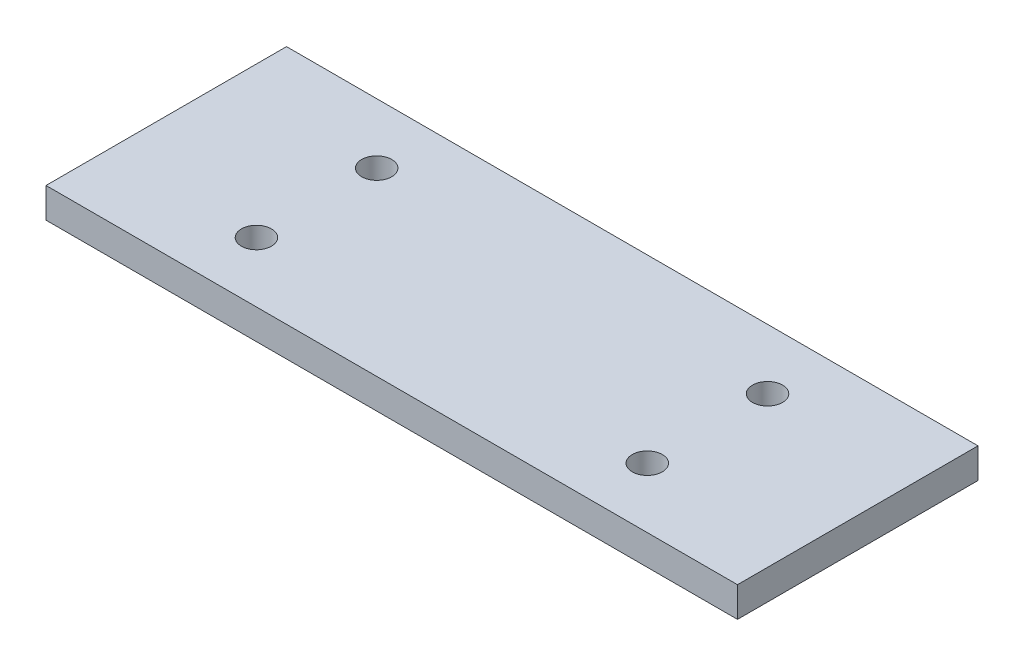
ISO-10303-21;
HEADER;
FILE_DESCRIPTION(('STEP AP214'),'2;1');
FILE_NAME('part.step','',(''),(''),'','','');
FILE_SCHEMA(('AUTOMOTIVE_DESIGN { 1 0 10303 214 1 1 1 1 }'));
ENDSEC;
DATA;
#1=APPLICATION_CONTEXT('core data for automotive mechanical design processes');
#2=APPLICATION_PROTOCOL_DEFINITION('international standard','automotive_design',2000,#1);
#3=PRODUCT_CONTEXT('',#1,'mechanical');
#4=PRODUCT('Part','Part','',(#3));
#5=PRODUCT_RELATED_PRODUCT_CATEGORY('part','',(#4));
#6=PRODUCT_DEFINITION_FORMATION('','',#4);
#7=PRODUCT_DEFINITION_CONTEXT('part definition',#1,'design');
#8=PRODUCT_DEFINITION('design','',#6,#7);
#9=PRODUCT_DEFINITION_SHAPE('','',#8);
#10=(LENGTH_UNIT() NAMED_UNIT(*) SI_UNIT(.MILLI.,.METRE.));
#11=(NAMED_UNIT(*) PLANE_ANGLE_UNIT() SI_UNIT($,.RADIAN.));
#12=(NAMED_UNIT(*) SI_UNIT($,.STERADIAN.) SOLID_ANGLE_UNIT());
#13=UNCERTAINTY_MEASURE_WITH_UNIT(LENGTH_MEASURE(1.E-05),#10,'distance_accuracy_value','');
#14=(GEOMETRIC_REPRESENTATION_CONTEXT(3) GLOBAL_UNCERTAINTY_ASSIGNED_CONTEXT((#13)) GLOBAL_UNIT_ASSIGNED_CONTEXT((#10,
#11,#12)) REPRESENTATION_CONTEXT('',''));
#15=CARTESIAN_POINT('',(0.,0.,0.));
#16=DIRECTION('',(0.,0.,1.));
#17=DIRECTION('',(1.,0.,0.));
#18=AXIS2_PLACEMENT_3D('',#15,#16,#17);
#19=CARTESIAN_POINT('',(0.,2.5,0.));
#20=DIRECTION('',(0.,-1.,0.));
#21=DIRECTION('',(0.,0.,-1.));
#22=AXIS2_PLACEMENT_3D('',#19,#20,#21);
#23=PLANE('',#22);
#24=DIRECTION('',(0.,0.,-1.));
#25=VECTOR('',#24,1.);
#26=CARTESIAN_POINT('',(57.5,2.5,20.));
#27=LINE('',#26,#25);
#28=CARTESIAN_POINT('',(57.5,2.5,20.));
#29=VERTEX_POINT('',#28);
#30=CARTESIAN_POINT('',(57.5,2.5,-20.));
#31=VERTEX_POINT('',#30);
#32=EDGE_CURVE('E91',#29,#31,#27,.T.);
#33=ORIENTED_EDGE('',*,*,#32,.T.);
#34=DIRECTION('',(-1.,0.,0.));
#35=VECTOR('',#34,1.);
#36=CARTESIAN_POINT('',(-57.5,2.5,-20.));
#37=LINE('',#36,#35);
#38=CARTESIAN_POINT('',(-57.5,2.5,-20.));
#39=VERTEX_POINT('',#38);
#40=EDGE_CURVE('E86',#31,#39,#37,.T.);
#41=ORIENTED_EDGE('',*,*,#40,.T.);
#42=DIRECTION('',(0.,0.,1.));
#43=VECTOR('',#42,1.);
#44=CARTESIAN_POINT('',(-57.5,2.5,20.));
#45=LINE('',#44,#43);
#46=CARTESIAN_POINT('',(-57.5,2.5,20.));
#47=VERTEX_POINT('',#46);
#48=EDGE_CURVE('E87',#39,#47,#45,.T.);
#49=ORIENTED_EDGE('',*,*,#48,.T.);
#50=DIRECTION('',(1.,0.,0.));
#51=VECTOR('',#50,1.);
#52=CARTESIAN_POINT('',(-57.5,2.5,20.));
#53=LINE('',#52,#51);
#54=EDGE_CURVE('E57',#47,#29,#53,.T.);
#55=ORIENTED_EDGE('',*,*,#54,.T.);
#56=EDGE_LOOP('',(#33,#41,#49,#55));
#57=FACE_BOUND('',#56,.T.);
#58=CARTESIAN_POINT('',(32.5,2.5,-10.));
#59=DIRECTION('',(0.,1.,0.));
#60=DIRECTION('',(0.,0.,1.));
#61=AXIS2_PLACEMENT_3D('',#58,#59,#60);
#62=CIRCLE('',#61,2.5);
#63=CARTESIAN_POINT('',(32.5,2.5,-7.5));
#64=VERTEX_POINT('',#63);
#65=EDGE_CURVE('E106',#64,#64,#62,.T.);
#66=ORIENTED_EDGE('',*,*,#65,.F.);
#67=EDGE_LOOP('',(#66));
#68=FACE_BOUND('',#67,.T.);
#69=CARTESIAN_POINT('',(32.5,2.5,10.));
#70=DIRECTION('',(0.,1.,0.));
#71=DIRECTION('',(0.,0.,-1.));
#72=AXIS2_PLACEMENT_3D('',#69,#70,#71);
#73=CIRCLE('',#72,2.5);
#74=CARTESIAN_POINT('',(32.5,2.5,7.50000000000003));
#75=VERTEX_POINT('',#74);
#76=EDGE_CURVE('E123',#75,#75,#73,.T.);
#77=ORIENTED_EDGE('',*,*,#76,.F.);
#78=EDGE_LOOP('',(#77));
#79=FACE_BOUND('',#78,.T.);
#80=CARTESIAN_POINT('',(-32.5,2.5,9.99999999999999));
#81=DIRECTION('',(0.,1.,0.));
#82=DIRECTION('',(0.,0.,1.));
#83=AXIS2_PLACEMENT_3D('',#80,#81,#82);
#84=CIRCLE('',#83,2.5);
#85=CARTESIAN_POINT('',(-32.5,2.5,12.5));
#86=VERTEX_POINT('',#85);
#87=EDGE_CURVE('E130',#86,#86,#84,.T.);
#88=ORIENTED_EDGE('',*,*,#87,.F.);
#89=EDGE_LOOP('',(#88));
#90=FACE_BOUND('',#89,.T.);
#91=CARTESIAN_POINT('',(-32.5,2.5,-10.));
#92=DIRECTION('',(0.,1.,0.));
#93=DIRECTION('',(0.,0.,-1.));
#94=AXIS2_PLACEMENT_3D('',#91,#92,#93);
#95=CIRCLE('',#94,2.5);
#96=CARTESIAN_POINT('',(-32.5,2.5,-12.5));
#97=VERTEX_POINT('',#96);
#98=EDGE_CURVE('E133',#97,#97,#95,.T.);
#99=ORIENTED_EDGE('',*,*,#98,.F.);
#100=EDGE_LOOP('',(#99));
#101=FACE_BOUND('',#100,.T.);
#102=ADVANCED_FACE('F39',(#57,#68,#79,#90,#101),#23,.F.);
#103=CARTESIAN_POINT('',(0.,-2.5,0.));
#104=DIRECTION('',(0.,-1.,0.));
#105=DIRECTION('',(0.,0.,-1.));
#106=AXIS2_PLACEMENT_3D('',#103,#104,#105);
#107=PLANE('',#106);
#108=CARTESIAN_POINT('',(-32.5,-2.5,9.99999999999999));
#109=DIRECTION('',(0.,1.,0.));
#110=DIRECTION('',(0.,0.,1.));
#111=AXIS2_PLACEMENT_3D('',#108,#109,#110);
#112=CIRCLE('',#111,2.5);
#113=CARTESIAN_POINT('',(-32.5,-2.5,12.5));
#114=VERTEX_POINT('',#113);
#115=EDGE_CURVE('E127',#114,#114,#112,.T.);
#116=ORIENTED_EDGE('',*,*,#115,.T.);
#117=EDGE_LOOP('',(#116));
#118=FACE_BOUND('',#117,.T.);
#119=CARTESIAN_POINT('',(32.5,-2.5,-10.));
#120=DIRECTION('',(0.,1.,0.));
#121=DIRECTION('',(0.,0.,1.));
#122=AXIS2_PLACEMENT_3D('',#119,#120,#121);
#123=CIRCLE('',#122,2.5);
#124=CARTESIAN_POINT('',(32.5,-2.5,-7.5));
#125=VERTEX_POINT('',#124);
#126=EDGE_CURVE('E119',#125,#125,#123,.T.);
#127=ORIENTED_EDGE('',*,*,#126,.T.);
#128=EDGE_LOOP('',(#127));
#129=FACE_BOUND('',#128,.T.);
#130=DIRECTION('',(0.,0.,-1.));
#131=VECTOR('',#130,1.);
#132=CARTESIAN_POINT('',(57.5,-2.5,20.));
#133=LINE('',#132,#131);
#134=CARTESIAN_POINT('',(57.5,-2.5,20.));
#135=VERTEX_POINT('',#134);
#136=CARTESIAN_POINT('',(57.5,-2.5,-20.));
#137=VERTEX_POINT('',#136);
#138=EDGE_CURVE('E104',#135,#137,#133,.T.);
#139=ORIENTED_EDGE('',*,*,#138,.F.);
#140=DIRECTION('',(1.,0.,0.));
#141=VECTOR('',#140,1.);
#142=CARTESIAN_POINT('',(-57.5,-2.5,20.));
#143=LINE('',#142,#141);
#144=CARTESIAN_POINT('',(-57.5,-2.5,20.));
#145=VERTEX_POINT('',#144);
#146=EDGE_CURVE('E80',#145,#135,#143,.T.);
#147=ORIENTED_EDGE('',*,*,#146,.F.);
#148=DIRECTION('',(0.,0.,1.));
#149=VECTOR('',#148,1.);
#150=CARTESIAN_POINT('',(-57.5,-2.5,20.));
#151=LINE('',#150,#149);
#152=CARTESIAN_POINT('',(-57.5,-2.5,-20.));
#153=VERTEX_POINT('',#152);
#154=EDGE_CURVE('E74',#153,#145,#151,.T.);
#155=ORIENTED_EDGE('',*,*,#154,.F.);
#156=DIRECTION('',(-1.,0.,0.));
#157=VECTOR('',#156,1.);
#158=CARTESIAN_POINT('',(-57.5,-2.5,-20.));
#159=LINE('',#158,#157);
#160=EDGE_CURVE('E94',#137,#153,#159,.T.);
#161=ORIENTED_EDGE('',*,*,#160,.F.);
#162=EDGE_LOOP('',(#139,#147,#155,#161));
#163=FACE_BOUND('',#162,.T.);
#164=CARTESIAN_POINT('',(32.5,-2.5,10.));
#165=DIRECTION('',(0.,1.,0.));
#166=DIRECTION('',(0.,0.,-1.));
#167=AXIS2_PLACEMENT_3D('',#164,#165,#166);
#168=CIRCLE('',#167,2.5);
#169=CARTESIAN_POINT('',(32.5,-2.5,7.50000000000003));
#170=VERTEX_POINT('',#169);
#171=EDGE_CURVE('E125',#170,#170,#168,.T.);
#172=ORIENTED_EDGE('',*,*,#171,.T.);
#173=EDGE_LOOP('',(#172));
#174=FACE_BOUND('',#173,.T.);
#175=CARTESIAN_POINT('',(-32.5,-2.5,-10.));
#176=DIRECTION('',(0.,1.,0.));
#177=DIRECTION('',(0.,0.,-1.));
#178=AXIS2_PLACEMENT_3D('',#175,#176,#177);
#179=CIRCLE('',#178,2.5);
#180=CARTESIAN_POINT('',(-32.5,-2.5,-12.5));
#181=VERTEX_POINT('',#180);
#182=EDGE_CURVE('E136',#181,#181,#179,.T.);
#183=ORIENTED_EDGE('',*,*,#182,.T.);
#184=EDGE_LOOP('',(#183));
#185=FACE_BOUND('',#184,.T.);
#186=ADVANCED_FACE('F114',(#118,#129,#163,#174,#185),#107,.T.);
#187=CARTESIAN_POINT('',(57.5,2.5,20.));
#188=DIRECTION('',(-1.,0.,0.));
#189=DIRECTION('',(0.,0.,1.));
#190=AXIS2_PLACEMENT_3D('',#187,#188,#189);
#191=PLANE('',#190);
#192=ORIENTED_EDGE('',*,*,#138,.T.);
#193=DIRECTION('',(0.,-1.,0.));
#194=VECTOR('',#193,1.);
#195=CARTESIAN_POINT('',(57.5,2.5,-20.));
#196=LINE('',#195,#194);
#197=EDGE_CURVE('E11',#31,#137,#196,.T.);
#198=ORIENTED_EDGE('',*,*,#197,.F.);
#199=ORIENTED_EDGE('',*,*,#32,.F.);
#200=DIRECTION('',(0.,-1.,0.));
#201=VECTOR('',#200,1.);
#202=CARTESIAN_POINT('',(57.5,2.5,20.));
#203=LINE('',#202,#201);
#204=EDGE_CURVE('E98',#29,#135,#203,.T.);
#205=ORIENTED_EDGE('',*,*,#204,.T.);
#206=EDGE_LOOP('',(#192,#198,#199,#205));
#207=FACE_BOUND('',#206,.T.);
#208=ADVANCED_FACE('F41',(#207),#191,.F.);
#209=CARTESIAN_POINT('',(-57.5,2.5,-20.));
#210=DIRECTION('',(0.,0.,1.));
#211=DIRECTION('',(1.,0.,0.));
#212=AXIS2_PLACEMENT_3D('',#209,#210,#211);
#213=PLANE('',#212);
#214=ORIENTED_EDGE('',*,*,#160,.T.);
#215=DIRECTION('',(0.,-1.,0.));
#216=VECTOR('',#215,1.);
#217=CARTESIAN_POINT('',(-57.5,2.5,-20.));
#218=LINE('',#217,#216);
#219=EDGE_CURVE('E48',#39,#153,#218,.T.);
#220=ORIENTED_EDGE('',*,*,#219,.F.);
#221=ORIENTED_EDGE('',*,*,#40,.F.);
#222=ORIENTED_EDGE('',*,*,#197,.T.);
#223=EDGE_LOOP('',(#214,#220,#221,#222));
#224=FACE_BOUND('',#223,.T.);
#225=ADVANCED_FACE('F92',(#224),#213,.F.);
#226=CARTESIAN_POINT('',(-57.5,2.5,20.));
#227=DIRECTION('',(1.,0.,0.));
#228=DIRECTION('',(0.,0.,-1.));
#229=AXIS2_PLACEMENT_3D('',#226,#227,#228);
#230=PLANE('',#229);
#231=ORIENTED_EDGE('',*,*,#154,.T.);
#232=DIRECTION('',(0.,-1.,0.));
#233=VECTOR('',#232,1.);
#234=CARTESIAN_POINT('',(-57.5,2.5,20.));
#235=LINE('',#234,#233);
#236=EDGE_CURVE('E96',#47,#145,#235,.T.);
#237=ORIENTED_EDGE('',*,*,#236,.F.);
#238=ORIENTED_EDGE('',*,*,#48,.F.);
#239=ORIENTED_EDGE('',*,*,#219,.T.);
#240=EDGE_LOOP('',(#231,#237,#238,#239));
#241=FACE_BOUND('',#240,.T.);
#242=ADVANCED_FACE('F100',(#241),#230,.F.);
#243=CARTESIAN_POINT('',(-57.5,2.5,20.));
#244=DIRECTION('',(0.,0.,-1.));
#245=DIRECTION('',(-1.,0.,0.));
#246=AXIS2_PLACEMENT_3D('',#243,#244,#245);
#247=PLANE('',#246);
#248=ORIENTED_EDGE('',*,*,#146,.T.);
#249=ORIENTED_EDGE('',*,*,#204,.F.);
#250=ORIENTED_EDGE('',*,*,#54,.F.);
#251=ORIENTED_EDGE('',*,*,#236,.T.);
#252=EDGE_LOOP('',(#248,#249,#250,#251));
#253=FACE_BOUND('',#252,.T.);
#254=ADVANCED_FACE('F112',(#253),#247,.F.);
#255=CARTESIAN_POINT('',(32.5,2.5,-10.));
#256=DIRECTION('',(0.,-1.,0.));
#257=DIRECTION('',(0.,0.,-1.));
#258=AXIS2_PLACEMENT_3D('',#255,#256,#257);
#259=CYLINDRICAL_SURFACE('',#258,2.5);
#260=ORIENTED_EDGE('',*,*,#65,.T.);
#261=EDGE_LOOP('',(#260));
#262=FACE_BOUND('',#261,.T.);
#263=ORIENTED_EDGE('',*,*,#126,.F.);
#264=EDGE_LOOP('',(#263));
#265=FACE_BOUND('',#264,.T.);
#266=ADVANCED_FACE('F154',(#262,#265),#259,.F.);
#267=CARTESIAN_POINT('',(32.5,2.5,10.));
#268=DIRECTION('',(0.,-1.,0.));
#269=DIRECTION('',(0.,0.,-1.));
#270=AXIS2_PLACEMENT_3D('',#267,#268,#269);
#271=CYLINDRICAL_SURFACE('',#270,2.5);
#272=ORIENTED_EDGE('',*,*,#76,.T.);
#273=EDGE_LOOP('',(#272));
#274=FACE_BOUND('',#273,.T.);
#275=ORIENTED_EDGE('',*,*,#171,.F.);
#276=EDGE_LOOP('',(#275));
#277=FACE_BOUND('',#276,.T.);
#278=ADVANCED_FACE('F199',(#274,#277),#271,.F.);
#279=CARTESIAN_POINT('',(-32.5,2.5,9.99999999999999));
#280=DIRECTION('',(0.,-1.,0.));
#281=DIRECTION('',(0.,0.,-1.));
#282=AXIS2_PLACEMENT_3D('',#279,#280,#281);
#283=CYLINDRICAL_SURFACE('',#282,2.5);
#284=ORIENTED_EDGE('',*,*,#87,.T.);
#285=EDGE_LOOP('',(#284));
#286=FACE_BOUND('',#285,.T.);
#287=ORIENTED_EDGE('',*,*,#115,.F.);
#288=EDGE_LOOP('',(#287));
#289=FACE_BOUND('',#288,.T.);
#290=ADVANCED_FACE('F206',(#286,#289),#283,.F.);
#291=CARTESIAN_POINT('',(-32.5,2.5,-10.));
#292=DIRECTION('',(0.,-1.,0.));
#293=DIRECTION('',(0.,0.,-1.));
#294=AXIS2_PLACEMENT_3D('',#291,#292,#293);
#295=CYLINDRICAL_SURFACE('',#294,2.5);
#296=ORIENTED_EDGE('',*,*,#98,.T.);
#297=EDGE_LOOP('',(#296));
#298=FACE_BOUND('',#297,.T.);
#299=ORIENTED_EDGE('',*,*,#182,.F.);
#300=EDGE_LOOP('',(#299));
#301=FACE_BOUND('',#300,.T.);
#302=ADVANCED_FACE('F145',(#298,#301),#295,.F.);
#303=CLOSED_SHELL('',(#102,#186,#208,#225,#242,#254,#266,#278,#290,#302));
#304=MANIFOLD_SOLID_BREP('B2',#303);
#305=ADVANCED_BREP_SHAPE_REPRESENTATION('',(#18,#304),#14);
#306=SHAPE_DEFINITION_REPRESENTATION(#9,#305);
ENDSEC;
END-ISO-10303-21;
